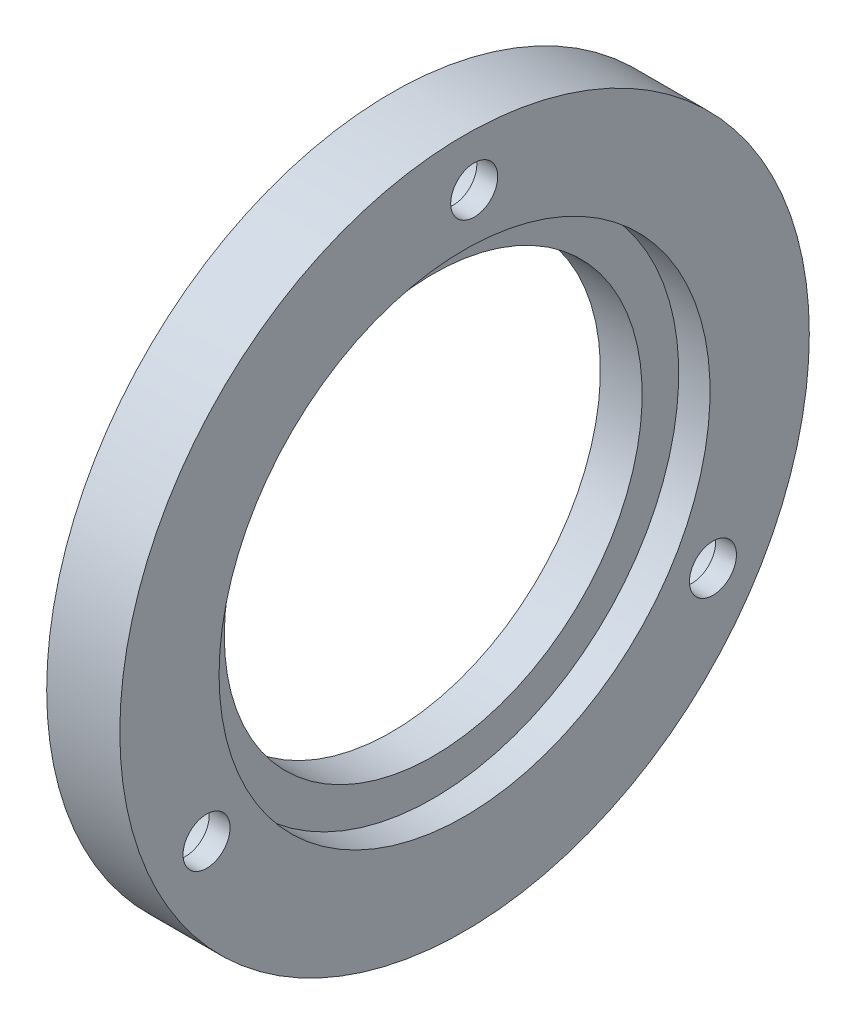
ISO-10303-21;
HEADER;
FILE_DESCRIPTION(('STEP AP214'),'2;1');
FILE_NAME('part.step','',(''),(''),'','','');
FILE_SCHEMA(('AUTOMOTIVE_DESIGN { 1 0 10303 214 1 1 1 1 }'));
ENDSEC;
DATA;
#1=APPLICATION_CONTEXT('core data for automotive mechanical design processes');
#2=APPLICATION_PROTOCOL_DEFINITION('international standard','automotive_design',2000,#1);
#3=PRODUCT_CONTEXT('',#1,'mechanical');
#4=PRODUCT('Part','Part','',(#3));
#5=PRODUCT_RELATED_PRODUCT_CATEGORY('part','',(#4));
#6=PRODUCT_DEFINITION_FORMATION('','',#4);
#7=PRODUCT_DEFINITION_CONTEXT('part definition',#1,'design');
#8=PRODUCT_DEFINITION('design','',#6,#7);
#9=PRODUCT_DEFINITION_SHAPE('','',#8);
#10=(LENGTH_UNIT() NAMED_UNIT(*) SI_UNIT(.MILLI.,.METRE.));
#11=(NAMED_UNIT(*) PLANE_ANGLE_UNIT() SI_UNIT($,.RADIAN.));
#12=(NAMED_UNIT(*) SI_UNIT($,.STERADIAN.) SOLID_ANGLE_UNIT());
#13=UNCERTAINTY_MEASURE_WITH_UNIT(LENGTH_MEASURE(1.E-05),#10,'distance_accuracy_value','');
#14=(GEOMETRIC_REPRESENTATION_CONTEXT(3) GLOBAL_UNCERTAINTY_ASSIGNED_CONTEXT((#13)) GLOBAL_UNIT_ASSIGNED_CONTEXT((#10,
#11,#12)) REPRESENTATION_CONTEXT('',''));
#15=CARTESIAN_POINT('',(0.,0.,0.));
#16=DIRECTION('',(0.,0.,1.));
#17=DIRECTION('',(1.,0.,0.));
#18=AXIS2_PLACEMENT_3D('',#15,#16,#17);
#19=CARTESIAN_POINT('',(-15.1382303839733,0.,0.));
#20=DIRECTION('',(-1.,0.,0.));
#21=DIRECTION('',(0.,0.,1.));
#22=AXIS2_PLACEMENT_3D('',#19,#20,#21);
#23=CYLINDRICAL_SURFACE('',#22,20.);
#24=CARTESIAN_POINT('',(4.,0.,0.));
#25=DIRECTION('',(-1.,0.,0.));
#26=DIRECTION('',(0.,0.,1.));
#27=AXIS2_PLACEMENT_3D('',#24,#25,#26);
#28=CIRCLE('',#27,20.);
#29=CARTESIAN_POINT('',(4.,0.,20.));
#30=VERTEX_POINT('',#29);
#31=EDGE_CURVE('E53',#30,#30,#28,.T.);
#32=ORIENTED_EDGE('',*,*,#31,.F.);
#33=EDGE_LOOP('',(#32));
#34=FACE_BOUND('',#33,.T.);
#35=CARTESIAN_POINT('',(0.,0.,0.));
#36=DIRECTION('',(-1.,0.,0.));
#37=DIRECTION('',(0.,0.,1.));
#38=AXIS2_PLACEMENT_3D('',#35,#36,#37);
#39=CIRCLE('',#38,20.);
#40=CARTESIAN_POINT('',(0.,0.,20.));
#41=VERTEX_POINT('',#40);
#42=EDGE_CURVE('E10',#41,#41,#39,.T.);
#43=ORIENTED_EDGE('',*,*,#42,.T.);
#44=EDGE_LOOP('',(#43));
#45=FACE_BOUND('',#44,.T.);
#46=ADVANCED_FACE('F31',(#34,#45),#23,.F.);
#47=CARTESIAN_POINT('',(0.,20.,0.));
#48=DIRECTION('',(1.,0.,0.));
#49=DIRECTION('',(0.,0.,-1.));
#50=AXIS2_PLACEMENT_3D('',#47,#48,#49);
#51=PLANE('',#50);
#52=CARTESIAN_POINT('',(0.,-14.7907987026771,-23.7746140607347));
#53=DIRECTION('',(-1.,0.,0.));
#54=DIRECTION('',(0.,0.,1.));
#55=AXIS2_PLACEMENT_3D('',#52,#53,#54);
#56=CIRCLE('',#55,4.);
#57=CARTESIAN_POINT('',(0.,-14.7907987026771,-19.7746140607347));
#58=VERTEX_POINT('',#57);
#59=EDGE_CURVE('E89',#58,#58,#56,.T.);
#60=ORIENTED_EDGE('',*,*,#59,.F.);
#61=EDGE_LOOP('',(#60));
#62=FACE_BOUND('',#61,.T.);
#63=CARTESIAN_POINT('',(0.,-13.1940203904283,24.6965144491477));
#64=DIRECTION('',(-1.,0.,0.));
#65=DIRECTION('',(0.,0.,1.));
#66=AXIS2_PLACEMENT_3D('',#63,#64,#65);
#67=CIRCLE('',#66,4.);
#68=CARTESIAN_POINT('',(0.,-13.1940203904283,28.6965144491477));
#69=VERTEX_POINT('',#68);
#70=EDGE_CURVE('E77',#69,#69,#67,.T.);
#71=ORIENTED_EDGE('',*,*,#70,.F.);
#72=EDGE_LOOP('',(#71));
#73=FACE_BOUND('',#72,.T.);
#74=CARTESIAN_POINT('',(0.,27.9848190931055,-0.921900388413231));
#75=DIRECTION('',(-1.,0.,0.));
#76=DIRECTION('',(0.,0.,1.));
#77=AXIS2_PLACEMENT_3D('',#74,#75,#76);
#78=CIRCLE('',#77,4.);
#79=CARTESIAN_POINT('',(0.,27.9848190931055,3.07809961158677));
#80=VERTEX_POINT('',#79);
#81=EDGE_CURVE('E65',#80,#80,#78,.T.);
#82=ORIENTED_EDGE('',*,*,#81,.F.);
#83=EDGE_LOOP('',(#82));
#84=FACE_BOUND('',#83,.T.);
#85=ORIENTED_EDGE('',*,*,#42,.F.);
#86=EDGE_LOOP('',(#85));
#87=FACE_BOUND('',#86,.T.);
#88=CARTESIAN_POINT('',(0.,0.,0.));
#89=DIRECTION('',(-1.,0.,0.));
#90=DIRECTION('',(0.,0.,1.));
#91=AXIS2_PLACEMENT_3D('',#88,#89,#90);
#92=CIRCLE('',#91,33.);
#93=CARTESIAN_POINT('',(0.,0.,33.));
#94=VERTEX_POINT('',#93);
#95=EDGE_CURVE('E37',#94,#94,#92,.T.);
#96=ORIENTED_EDGE('',*,*,#95,.T.);
#97=EDGE_LOOP('',(#96));
#98=FACE_BOUND('',#97,.T.);
#99=ADVANCED_FACE('F95',(#62,#73,#84,#87,#98),#51,.F.);
#100=CARTESIAN_POINT('',(-15.1382303839733,0.,0.));
#101=DIRECTION('',(-1.,0.,0.));
#102=DIRECTION('',(0.,0.,1.));
#103=AXIS2_PLACEMENT_3D('',#100,#101,#102);
#104=CYLINDRICAL_SURFACE('',#103,33.);
#105=ORIENTED_EDGE('',*,*,#95,.F.);
#106=EDGE_LOOP('',(#105));
#107=FACE_BOUND('',#106,.T.);
#108=CARTESIAN_POINT('',(7.,0.,0.));
#109=DIRECTION('',(-1.,0.,0.));
#110=DIRECTION('',(0.,0.,1.));
#111=AXIS2_PLACEMENT_3D('',#108,#109,#110);
#112=CIRCLE('',#111,33.);
#113=CARTESIAN_POINT('',(7.,0.,33.));
#114=VERTEX_POINT('',#113);
#115=EDGE_CURVE('E41',#114,#114,#112,.T.);
#116=ORIENTED_EDGE('',*,*,#115,.T.);
#117=EDGE_LOOP('',(#116));
#118=FACE_BOUND('',#117,.T.);
#119=ADVANCED_FACE('F98',(#107,#118),#104,.T.);
#120=CARTESIAN_POINT('',(7.,33.,0.));
#121=DIRECTION('',(-1.,0.,0.));
#122=DIRECTION('',(0.,0.,1.));
#123=AXIS2_PLACEMENT_3D('',#120,#121,#122);
#124=PLANE('',#123);
#125=CARTESIAN_POINT('',(7.,-14.7907987026771,-23.7746140607347));
#126=DIRECTION('',(-1.,0.,0.));
#127=DIRECTION('',(0.,0.,1.));
#128=AXIS2_PLACEMENT_3D('',#125,#126,#127);
#129=CIRCLE('',#128,2.25);
#130=CARTESIAN_POINT('',(7.,-14.7907987026771,-21.5246140607347));
#131=VERTEX_POINT('',#130);
#132=EDGE_CURVE('E80',#131,#131,#129,.T.);
#133=ORIENTED_EDGE('',*,*,#132,.T.);
#134=EDGE_LOOP('',(#133));
#135=FACE_BOUND('',#134,.T.);
#136=CARTESIAN_POINT('',(7.,-13.1940203904283,24.6965144491477));
#137=DIRECTION('',(-1.,0.,0.));
#138=DIRECTION('',(0.,0.,1.));
#139=AXIS2_PLACEMENT_3D('',#136,#137,#138);
#140=CIRCLE('',#139,2.25);
#141=CARTESIAN_POINT('',(7.,-13.1940203904283,26.9465144491477));
#142=VERTEX_POINT('',#141);
#143=EDGE_CURVE('E68',#142,#142,#140,.T.);
#144=ORIENTED_EDGE('',*,*,#143,.T.);
#145=EDGE_LOOP('',(#144));
#146=FACE_BOUND('',#145,.T.);
#147=CARTESIAN_POINT('',(7.,27.9848190931055,-0.921900388413231));
#148=DIRECTION('',(-1.,0.,0.));
#149=DIRECTION('',(0.,0.,1.));
#150=AXIS2_PLACEMENT_3D('',#147,#148,#149);
#151=CIRCLE('',#150,2.25);
#152=CARTESIAN_POINT('',(7.,27.9848190931055,1.32809961158677));
#153=VERTEX_POINT('',#152);
#154=EDGE_CURVE('E56',#153,#153,#151,.T.);
#155=ORIENTED_EDGE('',*,*,#154,.T.);
#156=EDGE_LOOP('',(#155));
#157=FACE_BOUND('',#156,.T.);
#158=ORIENTED_EDGE('',*,*,#115,.F.);
#159=EDGE_LOOP('',(#158));
#160=FACE_BOUND('',#159,.T.);
#161=CARTESIAN_POINT('',(7.,0.,0.));
#162=DIRECTION('',(-1.,0.,0.));
#163=DIRECTION('',(0.,0.,1.));
#164=AXIS2_PLACEMENT_3D('',#161,#162,#163);
#165=CIRCLE('',#164,23.5);
#166=CARTESIAN_POINT('',(7.,0.,23.5));
#167=VERTEX_POINT('',#166);
#168=EDGE_CURVE('E45',#167,#167,#165,.T.);
#169=ORIENTED_EDGE('',*,*,#168,.T.);
#170=EDGE_LOOP('',(#169));
#171=FACE_BOUND('',#170,.T.);
#172=ADVANCED_FACE('F138',(#135,#146,#157,#160,#171),#124,.F.);
#173=CARTESIAN_POINT('',(-15.1382303839733,0.,0.));
#174=DIRECTION('',(-1.,0.,0.));
#175=DIRECTION('',(0.,0.,1.));
#176=AXIS2_PLACEMENT_3D('',#173,#174,#175);
#177=CYLINDRICAL_SURFACE('',#176,23.5);
#178=ORIENTED_EDGE('',*,*,#168,.F.);
#179=EDGE_LOOP('',(#178));
#180=FACE_BOUND('',#179,.T.);
#181=CARTESIAN_POINT('',(4.,0.,0.));
#182=DIRECTION('',(-1.,0.,0.));
#183=DIRECTION('',(0.,0.,1.));
#184=AXIS2_PLACEMENT_3D('',#181,#182,#183);
#185=CIRCLE('',#184,23.5);
#186=CARTESIAN_POINT('',(4.,0.,23.5));
#187=VERTEX_POINT('',#186);
#188=EDGE_CURVE('E50',#187,#187,#185,.T.);
#189=ORIENTED_EDGE('',*,*,#188,.T.);
#190=EDGE_LOOP('',(#189));
#191=FACE_BOUND('',#190,.T.);
#192=ADVANCED_FACE('F129',(#180,#191),#177,.F.);
#193=CARTESIAN_POINT('',(4.,23.5,0.));
#194=DIRECTION('',(-1.,0.,0.));
#195=DIRECTION('',(0.,0.,1.));
#196=AXIS2_PLACEMENT_3D('',#193,#194,#195);
#197=PLANE('',#196);
#198=ORIENTED_EDGE('',*,*,#188,.F.);
#199=EDGE_LOOP('',(#198));
#200=FACE_BOUND('',#199,.T.);
#201=ORIENTED_EDGE('',*,*,#31,.T.);
#202=EDGE_LOOP('',(#201));
#203=FACE_BOUND('',#202,.T.);
#204=ADVANCED_FACE('F127',(#200,#203),#197,.F.);
#205=CARTESIAN_POINT('',(0.,27.9848190931055,-0.921900388413231));
#206=DIRECTION('',(-1.,0.,0.));
#207=DIRECTION('',(0.,0.,1.));
#208=AXIS2_PLACEMENT_3D('',#205,#206,#207);
#209=CYLINDRICAL_SURFACE('',#208,2.25);
#210=ORIENTED_EDGE('',*,*,#154,.F.);
#211=EDGE_LOOP('',(#210));
#212=FACE_BOUND('',#211,.T.);
#213=CARTESIAN_POINT('',(5.,27.9848190931055,-0.921900388413231));
#214=DIRECTION('',(-1.,0.,0.));
#215=DIRECTION('',(0.,0.,1.));
#216=AXIS2_PLACEMENT_3D('',#213,#214,#215);
#217=CIRCLE('',#216,2.25);
#218=CARTESIAN_POINT('',(5.,27.9848190931055,1.32809961158677));
#219=VERTEX_POINT('',#218);
#220=EDGE_CURVE('E59',#219,#219,#217,.T.);
#221=ORIENTED_EDGE('',*,*,#220,.T.);
#222=EDGE_LOOP('',(#221));
#223=FACE_BOUND('',#222,.T.);
#224=ADVANCED_FACE('F117',(#212,#223),#209,.F.);
#225=CARTESIAN_POINT('',(5.,30.2348190931055,-0.921900388413231));
#226=DIRECTION('',(1.,0.,0.));
#227=DIRECTION('',(0.,0.,-1.));
#228=AXIS2_PLACEMENT_3D('',#225,#226,#227);
#229=PLANE('',#228);
#230=ORIENTED_EDGE('',*,*,#220,.F.);
#231=EDGE_LOOP('',(#230));
#232=FACE_BOUND('',#231,.T.);
#233=CARTESIAN_POINT('',(5.,27.9848190931055,-0.921900388413231));
#234=DIRECTION('',(-1.,0.,0.));
#235=DIRECTION('',(0.,0.,1.));
#236=AXIS2_PLACEMENT_3D('',#233,#234,#235);
#237=CIRCLE('',#236,4.);
#238=CARTESIAN_POINT('',(5.,27.9848190931055,3.07809961158677));
#239=VERTEX_POINT('',#238);
#240=EDGE_CURVE('E62',#239,#239,#237,.T.);
#241=ORIENTED_EDGE('',*,*,#240,.T.);
#242=EDGE_LOOP('',(#241));
#243=FACE_BOUND('',#242,.T.);
#244=ADVANCED_FACE('F107',(#232,#243),#229,.F.);
#245=CARTESIAN_POINT('',(0.,27.9848190931055,-0.921900388413231));
#246=DIRECTION('',(-1.,0.,0.));
#247=DIRECTION('',(0.,0.,1.));
#248=AXIS2_PLACEMENT_3D('',#245,#246,#247);
#249=CYLINDRICAL_SURFACE('',#248,4.);
#250=ORIENTED_EDGE('',*,*,#240,.F.);
#251=EDGE_LOOP('',(#250));
#252=FACE_BOUND('',#251,.T.);
#253=ORIENTED_EDGE('',*,*,#81,.T.);
#254=EDGE_LOOP('',(#253));
#255=FACE_BOUND('',#254,.T.);
#256=ADVANCED_FACE('F104',(#252,#255),#249,.F.);
#257=CARTESIAN_POINT('',(0.,-13.1940203904283,24.6965144491477));
#258=DIRECTION('',(-1.,0.,0.));
#259=DIRECTION('',(0.,0.,1.));
#260=AXIS2_PLACEMENT_3D('',#257,#258,#259);
#261=CYLINDRICAL_SURFACE('',#260,2.25);
#262=ORIENTED_EDGE('',*,*,#143,.F.);
#263=EDGE_LOOP('',(#262));
#264=FACE_BOUND('',#263,.T.);
#265=CARTESIAN_POINT('',(5.,-13.1940203904283,24.6965144491477));
#266=DIRECTION('',(-1.,0.,0.));
#267=DIRECTION('',(0.,0.,1.));
#268=AXIS2_PLACEMENT_3D('',#265,#266,#267);
#269=CIRCLE('',#268,2.25);
#270=CARTESIAN_POINT('',(5.,-13.1940203904283,26.9465144491477));
#271=VERTEX_POINT('',#270);
#272=EDGE_CURVE('E71',#271,#271,#269,.T.);
#273=ORIENTED_EDGE('',*,*,#272,.T.);
#274=EDGE_LOOP('',(#273));
#275=FACE_BOUND('',#274,.T.);
#276=ADVANCED_FACE('F106',(#264,#275),#261,.F.);
#277=CARTESIAN_POINT('',(5.,-10.9440203904283,24.6965144491477));
#278=DIRECTION('',(1.,0.,0.));
#279=DIRECTION('',(0.,0.,-1.));
#280=AXIS2_PLACEMENT_3D('',#277,#278,#279);
#281=PLANE('',#280);
#282=ORIENTED_EDGE('',*,*,#272,.F.);
#283=EDGE_LOOP('',(#282));
#284=FACE_BOUND('',#283,.T.);
#285=CARTESIAN_POINT('',(5.,-13.1940203904283,24.6965144491477));
#286=DIRECTION('',(-1.,0.,0.));
#287=DIRECTION('',(0.,0.,1.));
#288=AXIS2_PLACEMENT_3D('',#285,#286,#287);
#289=CIRCLE('',#288,4.);
#290=CARTESIAN_POINT('',(5.,-13.1940203904283,28.6965144491477));
#291=VERTEX_POINT('',#290);
#292=EDGE_CURVE('E74',#291,#291,#289,.T.);
#293=ORIENTED_EDGE('',*,*,#292,.T.);
#294=EDGE_LOOP('',(#293));
#295=FACE_BOUND('',#294,.T.);
#296=ADVANCED_FACE('F114',(#284,#295),#281,.F.);
#297=CARTESIAN_POINT('',(0.,-13.1940203904283,24.6965144491477));
#298=DIRECTION('',(-1.,0.,0.));
#299=DIRECTION('',(0.,0.,1.));
#300=AXIS2_PLACEMENT_3D('',#297,#298,#299);
#301=CYLINDRICAL_SURFACE('',#300,4.);
#302=ORIENTED_EDGE('',*,*,#292,.F.);
#303=EDGE_LOOP('',(#302));
#304=FACE_BOUND('',#303,.T.);
#305=ORIENTED_EDGE('',*,*,#70,.T.);
#306=EDGE_LOOP('',(#305));
#307=FACE_BOUND('',#306,.T.);
#308=ADVANCED_FACE('F213',(#304,#307),#301,.F.);
#309=CARTESIAN_POINT('',(0.,-14.7907987026771,-23.7746140607347));
#310=DIRECTION('',(-1.,0.,0.));
#311=DIRECTION('',(0.,0.,1.));
#312=AXIS2_PLACEMENT_3D('',#309,#310,#311);
#313=CYLINDRICAL_SURFACE('',#312,2.25);
#314=ORIENTED_EDGE('',*,*,#132,.F.);
#315=EDGE_LOOP('',(#314));
#316=FACE_BOUND('',#315,.T.);
#317=CARTESIAN_POINT('',(5.,-14.7907987026771,-23.7746140607347));
#318=DIRECTION('',(-1.,0.,0.));
#319=DIRECTION('',(0.,0.,1.));
#320=AXIS2_PLACEMENT_3D('',#317,#318,#319);
#321=CIRCLE('',#320,2.25);
#322=CARTESIAN_POINT('',(5.,-14.7907987026771,-21.5246140607347));
#323=VERTEX_POINT('',#322);
#324=EDGE_CURVE('E83',#323,#323,#321,.T.);
#325=ORIENTED_EDGE('',*,*,#324,.T.);
#326=EDGE_LOOP('',(#325));
#327=FACE_BOUND('',#326,.T.);
#328=ADVANCED_FACE('F222',(#316,#327),#313,.F.);
#329=CARTESIAN_POINT('',(5.,-12.5407987026771,-23.7746140607347));
#330=DIRECTION('',(1.,0.,0.));
#331=DIRECTION('',(0.,0.,-1.));
#332=AXIS2_PLACEMENT_3D('',#329,#330,#331);
#333=PLANE('',#332);
#334=ORIENTED_EDGE('',*,*,#324,.F.);
#335=EDGE_LOOP('',(#334));
#336=FACE_BOUND('',#335,.T.);
#337=CARTESIAN_POINT('',(5.,-14.7907987026771,-23.7746140607347));
#338=DIRECTION('',(-1.,0.,0.));
#339=DIRECTION('',(0.,0.,1.));
#340=AXIS2_PLACEMENT_3D('',#337,#338,#339);
#341=CIRCLE('',#340,4.);
#342=CARTESIAN_POINT('',(5.,-14.7907987026771,-19.7746140607347));
#343=VERTEX_POINT('',#342);
#344=EDGE_CURVE('E86',#343,#343,#341,.T.);
#345=ORIENTED_EDGE('',*,*,#344,.T.);
#346=EDGE_LOOP('',(#345));
#347=FACE_BOUND('',#346,.T.);
#348=ADVANCED_FACE('F231',(#336,#347),#333,.F.);
#349=CARTESIAN_POINT('',(0.,-14.7907987026771,-23.7746140607347));
#350=DIRECTION('',(-1.,0.,0.));
#351=DIRECTION('',(0.,0.,1.));
#352=AXIS2_PLACEMENT_3D('',#349,#350,#351);
#353=CYLINDRICAL_SURFACE('',#352,4.);
#354=ORIENTED_EDGE('',*,*,#344,.F.);
#355=EDGE_LOOP('',(#354));
#356=FACE_BOUND('',#355,.T.);
#357=ORIENTED_EDGE('',*,*,#59,.T.);
#358=EDGE_LOOP('',(#357));
#359=FACE_BOUND('',#358,.T.);
#360=ADVANCED_FACE('F93',(#356,#359),#353,.F.);
#361=CLOSED_SHELL('',(#46,#99,#119,#172,#192,#204,#224,#244,#256,#276,#296,#308,#328,#348,#360));
#362=MANIFOLD_SOLID_BREP('B2',#361);
#363=ADVANCED_BREP_SHAPE_REPRESENTATION('',(#18,#362),#14);
#364=SHAPE_DEFINITION_REPRESENTATION(#9,#363);
ENDSEC;
END-ISO-10303-21;
